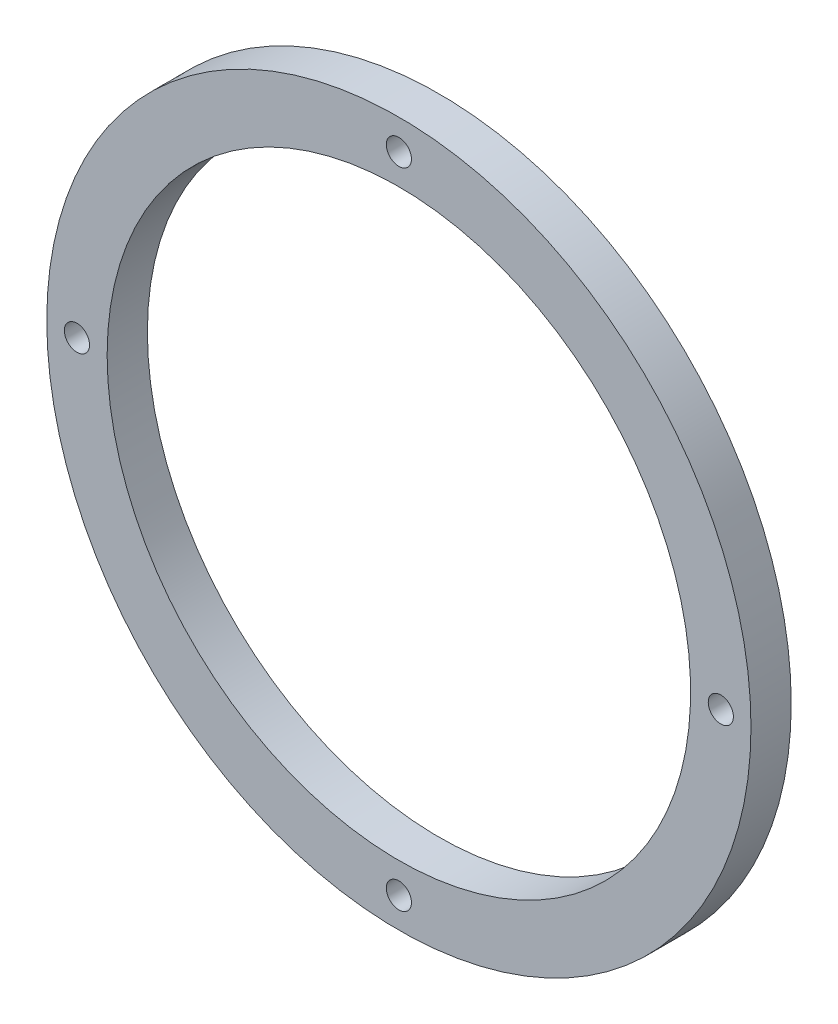
ISO-10303-21;
HEADER;
FILE_DESCRIPTION(('STEP AP214'),'2;1');
FILE_NAME('part.step','',(''),(''),'','','');
FILE_SCHEMA(('AUTOMOTIVE_DESIGN { 1 0 10303 214 1 1 1 1 }'));
ENDSEC;
DATA;
#1=APPLICATION_CONTEXT('core data for automotive mechanical design processes');
#2=APPLICATION_PROTOCOL_DEFINITION('international standard','automotive_design',2000,#1);
#3=PRODUCT_CONTEXT('',#1,'mechanical');
#4=PRODUCT('Part','Part','',(#3));
#5=PRODUCT_RELATED_PRODUCT_CATEGORY('part','',(#4));
#6=PRODUCT_DEFINITION_FORMATION('','',#4);
#7=PRODUCT_DEFINITION_CONTEXT('part definition',#1,'design');
#8=PRODUCT_DEFINITION('design','',#6,#7);
#9=PRODUCT_DEFINITION_SHAPE('','',#8);
#10=(LENGTH_UNIT() NAMED_UNIT(*) SI_UNIT(.MILLI.,.METRE.));
#11=(NAMED_UNIT(*) PLANE_ANGLE_UNIT() SI_UNIT($,.RADIAN.));
#12=(NAMED_UNIT(*) SI_UNIT($,.STERADIAN.) SOLID_ANGLE_UNIT());
#13=UNCERTAINTY_MEASURE_WITH_UNIT(LENGTH_MEASURE(1.E-05),#10,'distance_accuracy_value','');
#14=(GEOMETRIC_REPRESENTATION_CONTEXT(3) GLOBAL_UNCERTAINTY_ASSIGNED_CONTEXT((#13)) GLOBAL_UNIT_ASSIGNED_CONTEXT((#10,
#11,#12)) REPRESENTATION_CONTEXT('',''));
#15=CARTESIAN_POINT('',(0.,0.,0.));
#16=DIRECTION('',(0.,0.,1.));
#17=DIRECTION('',(1.,0.,0.));
#18=AXIS2_PLACEMENT_3D('',#15,#16,#17);
#19=CARTESIAN_POINT('',(-41.0121933088198,41.0121933088197,3.6721288561821));
#20=DIRECTION('',(0.707106781186548,-0.707106781186547,0.));
#21=DIRECTION('',(0.707106781186547,0.707106781186548,0.));
#22=AXIS2_PLACEMENT_3D('',#19,#20,#21);
#23=PLANE('',#22);
#24=CARTESIAN_POINT('',(-41.0121933088198,41.0121933088197,3.6721288561821));
#25=DIRECTION('',(0.707106781186548,-0.707106781186547,0.));
#26=DIRECTION('',(0.707106781186547,0.707106781186548,0.));
#27=AXIS2_PLACEMENT_3D('',#24,#25,#26);
#28=CIRCLE('',#27,2.117);
#29=CARTESIAN_POINT('',(-39.5152482530479,42.5091383645916,3.6721288561821));
#30=VERTEX_POINT('',#29);
#31=EDGE_CURVE('E18',#30,#30,#28,.F.);
#32=ORIENTED_EDGE('',*,*,#31,.T.);
#33=EDGE_LOOP('',(#32));
#34=FACE_BOUND('',#33,.T.);
#35=ADVANCED_FACE('F15',(#34),#23,.F.);
#36=CARTESIAN_POINT('',(-45.2548339959391,45.254833995939,3.6721288561821));
#37=DIRECTION('',(0.707106781186548,-0.707106781186547,0.));
#38=DIRECTION('',(0.707106781186547,0.707106781186548,0.));
#39=AXIS2_PLACEMENT_3D('',#36,#37,#38);
#40=CYLINDRICAL_SURFACE('',#39,2.117);
#41=ORIENTED_EDGE('',*,*,#31,.F.);
#42=EDGE_LOOP('',(#41));
#43=FACE_BOUND('',#42,.T.);
#44=CARTESIAN_POINT('',(-47.9778885013004,50.9717786128441,3.6721288561821));
#45=CARTESIAN_POINT('',(-47.9778923796831,50.9717753244488,3.79102191120579));
#46=CARTESIAN_POINT('',(-47.9852105341538,50.964889717831,3.90999358789722));
#47=CARTESIAN_POINT('',(-48.0142822336071,50.937501757635,4.14465097112454));
#48=CARTESIAN_POINT('',(-48.0360517058391,50.916984380034,4.26033290506842));
#49=CARTESIAN_POINT('',(-48.0933517327555,50.8628652688395,4.48499040895586));
#50=CARTESIAN_POINT('',(-48.1288762797946,50.8292692474197,4.59396888264504));
#51=CARTESIAN_POINT('',(-48.2125865899687,50.7498749315314,4.80214244331165));
#52=CARTESIAN_POINT('',(-48.2607690782506,50.7040797931666,4.90134005167087));
#53=CARTESIAN_POINT('',(-48.3683469106289,50.6014676521689,5.08720403279632));
#54=CARTESIAN_POINT('',(-48.4277454657036,50.5446474931224,5.17386680446393));
#55=CARTESIAN_POINT('',(-48.5559732952607,50.4214770006288,5.33219075762227));
#56=CARTESIAN_POINT('',(-48.6248050335469,50.3551241771754,5.4038480074975));
#57=CARTESIAN_POINT('',(-48.7698654803907,50.2146434246061,5.53013605290912));
#58=CARTESIAN_POINT('',(-48.8460986947377,50.1405107571123,5.58475639059448));
#59=CARTESIAN_POINT('',(-49.0036223972908,49.9865689082958,5.67531222284253));
#60=CARTESIAN_POINT('',(-49.0849072070288,49.9067660867953,5.71126828715434));
#61=CARTESIAN_POINT('',(-49.2217905347863,49.7716906008901,5.75458403678673));
#62=CARTESIAN_POINT('',(-49.27664364947,49.7173855057108,5.76752113156652));
#63=CARTESIAN_POINT('',(-49.3868458380948,49.6079176256536,5.78479520092648));
#64=CARTESIAN_POINT('',(-49.4421949112604,49.5527548421171,5.78913218895511));
#65=CARTESIAN_POINT('',(-49.581544551557,49.4134042256106,5.78912378767731));
#66=CARTESIAN_POINT('',(-49.6654541360977,49.3290622956952,5.77908019004741));
#67=CARTESIAN_POINT('',(-49.8305404722655,49.1622929441349,5.73915714830412));
#68=CARTESIAN_POINT('',(-49.9117141093796,49.0798677354454,5.7092558502834));
#69=CARTESIAN_POINT('',(-50.068979652443,48.9194224400718,5.63047128660807));
#70=CARTESIAN_POINT('',(-50.1450738430192,48.8414003754214,5.58159662311356));
#71=CARTESIAN_POINT('',(-50.2901175568232,48.6920417276363,5.4662649434754));
#72=CARTESIAN_POINT('',(-50.3590686740798,48.6207036532615,5.39981186189668));
#73=CARTESIAN_POINT('',(-50.4880201850713,48.4867866276011,5.2511749349466));
#74=CARTESIAN_POINT('',(-50.5480171539946,48.4242110283775,5.1689850978294));
#75=CARTESIAN_POINT('',(-50.6574377692179,48.3097328269419,4.99121834996575));
#76=CARTESIAN_POINT('',(-50.7068610269411,48.2578306169727,4.89564094744862));
#77=CARTESIAN_POINT('',(-50.7938414743261,48.1662710991169,4.69379342486004));
#78=CARTESIAN_POINT('',(-50.8313965827985,48.126615938891,4.58752143369705));
#79=CARTESIAN_POINT('',(-50.8936498589594,48.0607789028363,4.36731486363003));
#80=CARTESIAN_POINT('',(-50.9183480914966,48.0345969590499,4.25338032337843));
#81=CARTESIAN_POINT('',(-50.9542419648462,47.9965198479926,4.02111990586363));
#82=CARTESIAN_POINT('',(-50.9654417663284,47.9846202784188,3.90279539333465));
#83=CARTESIAN_POINT('',(-50.9740632064232,47.9754616615956,3.66508275143223));
#84=CARTESIAN_POINT('',(-50.9714848797282,47.9782025774822,3.54569462473766));
#85=CARTESIAN_POINT('',(-50.9526199091048,47.9982365260692,3.30928561054265));
#86=CARTESIAN_POINT('',(-50.9363378259608,48.0155247172508,3.19226394871978));
#87=CARTESIAN_POINT('',(-50.8904918936627,48.0641128198807,2.96386624155151));
#88=CARTESIAN_POINT('',(-50.8609278929193,48.0954128912494,2.85249026065756));
#89=CARTESIAN_POINT('',(-50.7892776859757,48.1710698831983,2.63852154706011));
#90=CARTESIAN_POINT('',(-50.7471889278806,48.2154294646084,2.53593060978291));
#91=CARTESIAN_POINT('',(-50.6515939130125,48.315844423254,2.3424734377744));
#92=CARTESIAN_POINT('',(-50.5980886035866,48.3718988300427,2.25160623120965));
#93=CARTESIAN_POINT('',(-50.481056871294,48.4940206156618,2.08414367583159));
#94=CARTESIAN_POINT('',(-50.4175283734945,48.5600900676278,2.00755128927218));
#95=CARTESIAN_POINT('',(-50.2821143035106,48.7002922301302,1.87080105490172));
#96=CARTESIAN_POINT('',(-50.2102247979894,48.7744287346507,1.81065098712692));
#97=CARTESIAN_POINT('',(-50.0600151269505,48.9285854737257,1.70850122500293));
#98=CARTESIAN_POINT('',(-49.981689595103,49.0086106122677,1.66651686366786));
#99=CARTESIAN_POINT('',(-49.8209128911974,49.1720419482563,1.60203288778191));
#100=CARTESIAN_POINT('',(-49.7384708976586,49.2554405513082,1.57949180731304));
#101=CARTESIAN_POINT('',(-49.6290293164869,49.365583580045,1.563009173494));
#102=CARTESIAN_POINT('',(-49.6027941111588,49.3919447202899,1.56005612721404));
#103=CARTESIAN_POINT('',(-49.5502083221129,49.4446988309135,1.55611519425554));
#104=CARTESIAN_POINT('',(-49.523857738327,49.4710918013108,1.55512730873445));
#105=CARTESIAN_POINT('',(-49.4134814093143,49.5814674043791,1.55513378264695));
#106=CARTESIAN_POINT('',(-49.3291590256564,49.6653578736808,1.56516696068587));
#107=CARTESIAN_POINT('',(-49.1623696332638,49.83046506707,1.6050695896938));
#108=CARTESIAN_POINT('',(-49.0799069822612,49.9116756836977,1.63498145386836));
#109=CARTESIAN_POINT('',(-48.9194135019994,50.068988370085,1.71379195031312));
#110=CARTESIAN_POINT('',(-48.8413790504129,50.1450946248308,1.76267479975102));
#111=CARTESIAN_POINT('',(-48.6920210030223,50.2901376096804,1.87801152864197));
#112=CARTESIAN_POINT('',(-48.6206940442698,50.3590779344264,1.94445653855248));
#113=CARTESIAN_POINT('',(-48.4867960542407,50.4880111003123,2.09307229171999));
#114=CARTESIAN_POINT('',(-48.4242283982902,50.548000492866,2.17524906836585));
#115=CARTESIAN_POINT('',(-48.3097470521041,50.6574242312107,2.35301384699408));
#116=CARTESIAN_POINT('',(-48.2578366898532,50.7068552801105,2.44860602260153));
#117=CARTESIAN_POINT('',(-48.1662459556863,50.793865337938,2.65051707023152));
#118=CARTESIAN_POINT('',(-48.1265728395569,50.8314373156154,2.75684225674574));
#119=CARTESIAN_POINT('',(-48.0607487967235,50.8936783466267,2.9770817286271));
#120=CARTESIAN_POINT('',(-48.0345828762167,50.918361707456,3.09098743983721));
#121=CARTESIAN_POINT('',(-48.0030498192016,50.9480861805228,3.28329081823913));
#122=CARTESIAN_POINT('',(-47.9936277907437,50.956959948849,3.36047724490806));
#123=CARTESIAN_POINT('',(-47.9810458563421,50.9688072464687,3.51580740189022));
#124=CARTESIAN_POINT('',(-47.977885951083,50.9717807751173,3.59395113230807));
#125=CARTESIAN_POINT('',(-47.9778885013004,50.9717786128441,3.6721288561821));
#126=B_SPLINE_CURVE_WITH_KNOTS('',3,(#44,#45,#46,#47,#48,#49,#50,#51,#52,#53,#54,#55,#56,#57,
#58,#59,#60,#61,#62,#63,#64,#65,#66,#67,#68,#69,#70,#71,#72,#73,#74,#75,#76,#77,#78,#79,#80,#81,
#82,#83,#84,#85,#86,#87,#88,#89,#90,#91,#92,#93,#94,#95,#96,#97,#98,#99,#100,#101,#102,#103,
#104,#105,#106,#107,#108,#109,#110,#111,#112,#113,#114,#115,#116,#117,#118,#119,#120,#121,#122,
#123,#124,#125),.UNSPECIFIED.,.T.,.F.,(4,2,2,2,2,2,2,2,2,2,2,2,2,2,2,2,2,2,2,2,2,2,2,2,2,2,2,2,
2,2,2,2,2,2,2,2,2,2,2,2,4),(0.,0.356394656004261,0.713182759293739,1.06981520781923,
1.42635547937701,1.78299797781832,2.13973380401006,2.49668817810954,2.85324831586279,
3.08759463498784,3.32194058765251,3.67833557234476,4.03512343024775,4.39174971594141,
4.74829624566907,5.10497880088052,5.4616744616893,5.81843263770319,6.17518901424624,
6.53183539834717,6.88848088443503,7.24500772128182,7.60153862734504,7.95814222567963,
8.31471624449951,8.67136417595359,9.02818057206741,9.38529755920432,9.74165104054998,
9.85353985219447,9.9654287297391,10.321638919378,10.6786115703189,11.0352878737934,
11.3917843855616,11.7484178944487,12.1051626015086,12.4621184271188,12.8186771534888,
13.0530232215304,13.2873693151835),.UNSPECIFIED.);
#127=CARTESIAN_POINT('',(-47.9778885013004,50.9717786128441,3.6721288561821));
#128=VERTEX_POINT('',#127);
#129=EDGE_CURVE('E50',#128,#128,#126,.T.);
#130=ORIENTED_EDGE('',*,*,#129,.F.);
#131=EDGE_LOOP('',(#130));
#132=FACE_BOUND('',#131,.T.);
#133=ADVANCED_FACE('F59',(#43,#132),#40,.F.);
#134=CARTESIAN_POINT('',(0.,-64.0000009536743,1.13686837721616E-10));
#135=DIRECTION('',(0.,0.,-1.));
#136=DIRECTION('',(-1.,0.,0.));
#137=AXIS2_PLACEMENT_3D('',#134,#135,#136);
#138=CONICAL_SURFACE('',#137,4.99999999988176,0.785398163397448);
#139=CARTESIAN_POINT('',(0.,-64.0000009536743,2.5));
#140=DIRECTION('',(0.,0.,-1.));
#141=DIRECTION('',(-1.,0.,0.));
#142=AXIS2_PLACEMENT_3D('',#139,#140,#141);
#143=CIRCLE('',#142,2.5);
#144=CARTESIAN_POINT('',(-2.50000000000001,-64.0000009536743,2.5));
#145=VERTEX_POINT('',#144);
#146=EDGE_CURVE('E30',#145,#145,#143,.F.);
#147=ORIENTED_EDGE('',*,*,#146,.T.);
#148=EDGE_LOOP('',(#147));
#149=FACE_BOUND('',#148,.T.);
#150=CARTESIAN_POINT('',(0.,-64.0000009536743,5.68356126051661E-11));
#151=DIRECTION('',(0.,0.,-1.));
#152=DIRECTION('',(-1.,0.,0.));
#153=AXIS2_PLACEMENT_3D('',#150,#151,#152);
#154=CIRCLE('',#153,4.99999999993861);
#155=CARTESIAN_POINT('',(-4.99999999993862,-64.0000009536743,5.68356126051661E-11));
#156=VERTEX_POINT('',#155);
#157=EDGE_CURVE('E138',#156,#156,#154,.T.);
#158=ORIENTED_EDGE('',*,*,#157,.T.);
#159=EDGE_LOOP('',(#158));
#160=FACE_BOUND('',#159,.T.);
#161=ADVANCED_FACE('F84',(#149,#160),#138,.F.);
#162=CARTESIAN_POINT('',(-64.0000009536743,0.,5.6843418860808E-11));
#163=DIRECTION('',(0.,0.,-1.));
#164=DIRECTION('',(-1.,0.,0.));
#165=AXIS2_PLACEMENT_3D('',#162,#163,#164);
#166=CONICAL_SURFACE('',#165,4.99999999989087,0.785398163397448);
#167=CARTESIAN_POINT('',(-64.0000009536743,0.,2.5));
#168=DIRECTION('',(0.,0.,-1.));
#169=DIRECTION('',(-1.,0.,0.));
#170=AXIS2_PLACEMENT_3D('',#167,#168,#169);
#171=CIRCLE('',#170,2.5);
#172=CARTESIAN_POINT('',(-66.5000009536743,0.,2.5));
#173=VERTEX_POINT('',#172);
#174=EDGE_CURVE('E49',#173,#173,#171,.F.);
#175=ORIENTED_EDGE('',*,*,#174,.T.);
#176=EDGE_LOOP('',(#175));
#177=FACE_BOUND('',#176,.T.);
#178=CARTESIAN_POINT('',(-64.0000009536743,0.,-4.77395900588817E-11));
#179=DIRECTION('',(0.,0.,-1.));
#180=DIRECTION('',(-1.,0.,0.));
#181=AXIS2_PLACEMENT_3D('',#178,#179,#180);
#182=CIRCLE('',#181,4.99999999999545);
#183=CARTESIAN_POINT('',(-69.0000009536698,0.,-4.77395900588817E-11));
#184=VERTEX_POINT('',#183);
#185=EDGE_CURVE('E142',#184,#184,#182,.T.);
#186=ORIENTED_EDGE('',*,*,#185,.T.);
#187=EDGE_LOOP('',(#186));
#188=FACE_BOUND('',#187,.T.);
#189=ADVANCED_FACE('F81',(#177,#188),#166,.F.);
#190=CARTESIAN_POINT('',(0.,0.,0.));
#191=DIRECTION('',(0.,0.,1.));
#192=DIRECTION('',(1.,0.,0.));
#193=AXIS2_PLACEMENT_3D('',#190,#191,#192);
#194=PLANE('',#193);
#195=CARTESIAN_POINT('',(0.,0.,0.));
#196=DIRECTION('',(0.,0.,-1.));
#197=DIRECTION('',(-1.,0.,0.));
#198=AXIS2_PLACEMENT_3D('',#195,#196,#197);
#199=CIRCLE('',#198,58.);
#200=CARTESIAN_POINT('',(-58.,0.,0.));
#201=VERTEX_POINT('',#200);
#202=EDGE_CURVE('E45',#201,#201,#199,.F.);
#203=ORIENTED_EDGE('',*,*,#202,.T.);
#204=EDGE_LOOP('',(#203));
#205=FACE_BOUND('',#204,.T.);
#206=ORIENTED_EDGE('',*,*,#157,.F.);
#207=EDGE_LOOP('',(#206));
#208=FACE_BOUND('',#207,.T.);
#209=CARTESIAN_POINT('',(64.0000009536743,0.,4.77395900588817E-11));
#210=DIRECTION('',(0.,0.,-1.));
#211=DIRECTION('',(-1.,0.,0.));
#212=AXIS2_PLACEMENT_3D('',#209,#210,#211);
#213=CIRCLE('',#212,4.99999999993861);
#214=CARTESIAN_POINT('',(59.0000009537357,0.,4.77395900588817E-11));
#215=VERTEX_POINT('',#214);
#216=EDGE_CURVE('E133',#215,#215,#213,.F.);
#217=ORIENTED_EDGE('',*,*,#216,.T.);
#218=EDGE_LOOP('',(#217));
#219=FACE_BOUND('',#218,.T.);
#220=CARTESIAN_POINT('',(0.,64.0000009536743,5.6843418860808E-11));
#221=DIRECTION('',(0.,0.,-1.));
#222=DIRECTION('',(-1.,0.,0.));
#223=AXIS2_PLACEMENT_3D('',#220,#221,#222);
#224=CIRCLE('',#223,4.99999999993861);
#225=CARTESIAN_POINT('',(-4.99999999993861,64.0000009536743,5.6843418860808E-11));
#226=VERTEX_POINT('',#225);
#227=EDGE_CURVE('E135',#226,#226,#224,.F.);
#228=ORIENTED_EDGE('',*,*,#227,.T.);
#229=EDGE_LOOP('',(#228));
#230=FACE_BOUND('',#229,.T.);
#231=ORIENTED_EDGE('',*,*,#185,.F.);
#232=EDGE_LOOP('',(#231));
#233=FACE_BOUND('',#232,.T.);
#234=CARTESIAN_POINT('',(0.,0.,0.));
#235=DIRECTION('',(0.,0.,-1.));
#236=DIRECTION('',(-1.,0.,0.));
#237=AXIS2_PLACEMENT_3D('',#234,#235,#236);
#238=CIRCLE('',#237,70.);
#239=CARTESIAN_POINT('',(-70.,0.,0.));
#240=VERTEX_POINT('',#239);
#241=EDGE_CURVE('E57',#240,#240,#238,.F.);
#242=ORIENTED_EDGE('',*,*,#241,.F.);
#243=EDGE_LOOP('',(#242));
#244=FACE_BOUND('',#243,.T.);
#245=ADVANCED_FACE('F77',(#205,#208,#219,#230,#233,#244),#194,.F.);
#246=CARTESIAN_POINT('',(0.,64.0000009536743,1.13686837721616E-10));
#247=DIRECTION('',(0.,0.,-1.));
#248=DIRECTION('',(-1.,0.,0.));
#249=AXIS2_PLACEMENT_3D('',#246,#247,#248);
#250=CONICAL_SURFACE('',#249,4.99999999988177,0.785398163397448);
#251=CARTESIAN_POINT('',(0.,64.0000009536743,2.5));
#252=DIRECTION('',(0.,0.,-1.));
#253=DIRECTION('',(-1.,0.,0.));
#254=AXIS2_PLACEMENT_3D('',#251,#252,#253);
#255=CIRCLE('',#254,2.5);
#256=CARTESIAN_POINT('',(-2.5,64.0000009536743,2.5));
#257=VERTEX_POINT('',#256);
#258=EDGE_CURVE('E48',#257,#257,#255,.F.);
#259=ORIENTED_EDGE('',*,*,#258,.T.);
#260=EDGE_LOOP('',(#259));
#261=FACE_BOUND('',#260,.T.);
#262=ORIENTED_EDGE('',*,*,#227,.F.);
#263=EDGE_LOOP('',(#262));
#264=FACE_BOUND('',#263,.T.);
#265=ADVANCED_FACE('F73',(#261,#264),#250,.F.);
#266=CARTESIAN_POINT('',(64.0000009536743,0.,1.13686837721616E-10));
#267=DIRECTION('',(0.,0.,-1.));
#268=DIRECTION('',(-1.,0.,0.));
#269=AXIS2_PLACEMENT_3D('',#266,#267,#268);
#270=CONICAL_SURFACE('',#269,4.99999999987266,0.785398163397448);
#271=CARTESIAN_POINT('',(64.0000009536743,0.,2.5));
#272=DIRECTION('',(0.,0.,-1.));
#273=DIRECTION('',(-1.,0.,0.));
#274=AXIS2_PLACEMENT_3D('',#271,#272,#273);
#275=CIRCLE('',#274,2.5);
#276=CARTESIAN_POINT('',(61.5000009536743,0.,2.5));
#277=VERTEX_POINT('',#276);
#278=EDGE_CURVE('E44',#277,#277,#275,.F.);
#279=ORIENTED_EDGE('',*,*,#278,.T.);
#280=EDGE_LOOP('',(#279));
#281=FACE_BOUND('',#280,.T.);
#282=ORIENTED_EDGE('',*,*,#216,.F.);
#283=EDGE_LOOP('',(#282));
#284=FACE_BOUND('',#283,.T.);
#285=ADVANCED_FACE('F68',(#281,#284),#270,.F.);
#286=CARTESIAN_POINT('',(0.,0.,8.));
#287=DIRECTION('',(0.,0.,-1.));
#288=DIRECTION('',(-1.,0.,0.));
#289=AXIS2_PLACEMENT_3D('',#286,#287,#288);
#290=CYLINDRICAL_SURFACE('',#289,70.);
#291=CARTESIAN_POINT('',(0.,0.,8.));
#292=DIRECTION('',(0.,0.,-1.));
#293=DIRECTION('',(-1.,0.,0.));
#294=AXIS2_PLACEMENT_3D('',#291,#292,#293);
#295=CIRCLE('',#294,70.);
#296=CARTESIAN_POINT('',(-70.,0.,8.));
#297=VERTEX_POINT('',#296);
#298=EDGE_CURVE('E41',#297,#297,#295,.F.);
#299=ORIENTED_EDGE('',*,*,#298,.F.);
#300=EDGE_LOOP('',(#299));
#301=FACE_BOUND('',#300,.T.);
#302=ORIENTED_EDGE('',*,*,#129,.T.);
#303=EDGE_LOOP('',(#302));
#304=FACE_BOUND('',#303,.T.);
#305=ORIENTED_EDGE('',*,*,#241,.T.);
#306=EDGE_LOOP('',(#305));
#307=FACE_BOUND('',#306,.T.);
#308=ADVANCED_FACE('F62',(#301,#304,#307),#290,.T.);
#309=CARTESIAN_POINT('',(0.,-64.0000009536743,8.));
#310=DIRECTION('',(0.,0.,-1.));
#311=DIRECTION('',(-1.,0.,0.));
#312=AXIS2_PLACEMENT_3D('',#309,#310,#311);
#313=CYLINDRICAL_SURFACE('',#312,2.5);
#314=CARTESIAN_POINT('',(0.,-64.0000009536743,8.));
#315=DIRECTION('',(0.,0.,-1.));
#316=DIRECTION('',(-1.,0.,0.));
#317=AXIS2_PLACEMENT_3D('',#314,#315,#316);
#318=CIRCLE('',#317,2.5);
#319=CARTESIAN_POINT('',(-2.50000000000001,-64.0000009536743,8.));
#320=VERTEX_POINT('',#319);
#321=EDGE_CURVE('E38',#320,#320,#318,.T.);
#322=ORIENTED_EDGE('',*,*,#321,.F.);
#323=EDGE_LOOP('',(#322));
#324=FACE_BOUND('',#323,.T.);
#325=ORIENTED_EDGE('',*,*,#146,.F.);
#326=EDGE_LOOP('',(#325));
#327=FACE_BOUND('',#326,.T.);
#328=ADVANCED_FACE('F67',(#324,#327),#313,.F.);
#329=CARTESIAN_POINT('',(-64.0000009536743,0.,8.));
#330=DIRECTION('',(0.,0.,-1.));
#331=DIRECTION('',(-1.,0.,0.));
#332=AXIS2_PLACEMENT_3D('',#329,#330,#331);
#333=CYLINDRICAL_SURFACE('',#332,2.5);
#334=CARTESIAN_POINT('',(-64.0000009536743,0.,8.));
#335=DIRECTION('',(0.,0.,-1.));
#336=DIRECTION('',(-1.,0.,0.));
#337=AXIS2_PLACEMENT_3D('',#334,#335,#336);
#338=CIRCLE('',#337,2.5);
#339=CARTESIAN_POINT('',(-66.5000009536743,0.,8.));
#340=VERTEX_POINT('',#339);
#341=EDGE_CURVE('E35',#340,#340,#338,.T.);
#342=ORIENTED_EDGE('',*,*,#341,.F.);
#343=EDGE_LOOP('',(#342));
#344=FACE_BOUND('',#343,.T.);
#345=ORIENTED_EDGE('',*,*,#174,.F.);
#346=EDGE_LOOP('',(#345));
#347=FACE_BOUND('',#346,.T.);
#348=ADVANCED_FACE('F112',(#344,#347),#333,.F.);
#349=CARTESIAN_POINT('',(0.,0.,8.));
#350=DIRECTION('',(0.,0.,-1.));
#351=DIRECTION('',(-1.,0.,0.));
#352=AXIS2_PLACEMENT_3D('',#349,#350,#351);
#353=CYLINDRICAL_SURFACE('',#352,58.);
#354=CARTESIAN_POINT('',(0.,0.,8.));
#355=DIRECTION('',(0.,0.,-1.));
#356=DIRECTION('',(-1.,0.,0.));
#357=AXIS2_PLACEMENT_3D('',#354,#355,#356);
#358=CIRCLE('',#357,58.);
#359=CARTESIAN_POINT('',(-58.,0.,8.));
#360=VERTEX_POINT('',#359);
#361=EDGE_CURVE('E27',#360,#360,#358,.T.);
#362=ORIENTED_EDGE('',*,*,#361,.F.);
#363=EDGE_LOOP('',(#362));
#364=FACE_BOUND('',#363,.T.);
#365=ORIENTED_EDGE('',*,*,#202,.F.);
#366=EDGE_LOOP('',(#365));
#367=FACE_BOUND('',#366,.T.);
#368=ADVANCED_FACE('F109',(#364,#367),#353,.F.);
#369=CARTESIAN_POINT('',(0.,64.0000009536743,8.));
#370=DIRECTION('',(0.,0.,-1.));
#371=DIRECTION('',(-1.,0.,0.));
#372=AXIS2_PLACEMENT_3D('',#369,#370,#371);
#373=CYLINDRICAL_SURFACE('',#372,2.5);
#374=CARTESIAN_POINT('',(0.,64.0000009536743,8.));
#375=DIRECTION('',(0.,0.,-1.));
#376=DIRECTION('',(-1.,0.,0.));
#377=AXIS2_PLACEMENT_3D('',#374,#375,#376);
#378=CIRCLE('',#377,2.5);
#379=CARTESIAN_POINT('',(-2.5,64.0000009536743,8.));
#380=VERTEX_POINT('',#379);
#381=EDGE_CURVE('E22',#380,#380,#378,.T.);
#382=ORIENTED_EDGE('',*,*,#381,.F.);
#383=EDGE_LOOP('',(#382));
#384=FACE_BOUND('',#383,.T.);
#385=ORIENTED_EDGE('',*,*,#258,.F.);
#386=EDGE_LOOP('',(#385));
#387=FACE_BOUND('',#386,.T.);
#388=ADVANCED_FACE('F102',(#384,#387),#373,.F.);
#389=CARTESIAN_POINT('',(64.0000009536743,0.,8.));
#390=DIRECTION('',(0.,0.,-1.));
#391=DIRECTION('',(-1.,0.,0.));
#392=AXIS2_PLACEMENT_3D('',#389,#390,#391);
#393=CYLINDRICAL_SURFACE('',#392,2.5);
#394=CARTESIAN_POINT('',(64.0000009536743,0.,8.));
#395=DIRECTION('',(0.,0.,-1.));
#396=DIRECTION('',(-1.,0.,0.));
#397=AXIS2_PLACEMENT_3D('',#394,#395,#396);
#398=CIRCLE('',#397,2.5);
#399=CARTESIAN_POINT('',(61.5000009536743,0.,8.));
#400=VERTEX_POINT('',#399);
#401=EDGE_CURVE('E10',#400,#400,#398,.T.);
#402=ORIENTED_EDGE('',*,*,#401,.F.);
#403=EDGE_LOOP('',(#402));
#404=FACE_BOUND('',#403,.T.);
#405=ORIENTED_EDGE('',*,*,#278,.F.);
#406=EDGE_LOOP('',(#405));
#407=FACE_BOUND('',#406,.T.);
#408=ADVANCED_FACE('F97',(#404,#407),#393,.F.);
#409=CARTESIAN_POINT('',(0.,0.,8.));
#410=DIRECTION('',(0.,0.,1.));
#411=DIRECTION('',(1.,0.,0.));
#412=AXIS2_PLACEMENT_3D('',#409,#410,#411);
#413=PLANE('',#412);
#414=ORIENTED_EDGE('',*,*,#401,.T.);
#415=EDGE_LOOP('',(#414));
#416=FACE_BOUND('',#415,.T.);
#417=ORIENTED_EDGE('',*,*,#381,.T.);
#418=EDGE_LOOP('',(#417));
#419=FACE_BOUND('',#418,.T.);
#420=ORIENTED_EDGE('',*,*,#361,.T.);
#421=EDGE_LOOP('',(#420));
#422=FACE_BOUND('',#421,.T.);
#423=ORIENTED_EDGE('',*,*,#341,.T.);
#424=EDGE_LOOP('',(#423));
#425=FACE_BOUND('',#424,.T.);
#426=ORIENTED_EDGE('',*,*,#321,.T.);
#427=EDGE_LOOP('',(#426));
#428=FACE_BOUND('',#427,.T.);
#429=ORIENTED_EDGE('',*,*,#298,.T.);
#430=EDGE_LOOP('',(#429));
#431=FACE_BOUND('',#430,.T.);
#432=ADVANCED_FACE('F95',(#416,#419,#422,#425,#428,#431),#413,.T.);
#433=CLOSED_SHELL('',(#35,#133,#161,#189,#245,#265,#285,#308,#328,#348,#368,#388,#408,#432));
#434=MANIFOLD_SOLID_BREP('B1',#433);
#435=ADVANCED_BREP_SHAPE_REPRESENTATION('',(#18,#434),#14);
#436=SHAPE_DEFINITION_REPRESENTATION(#9,#435);
ENDSEC;
END-ISO-10303-21;
